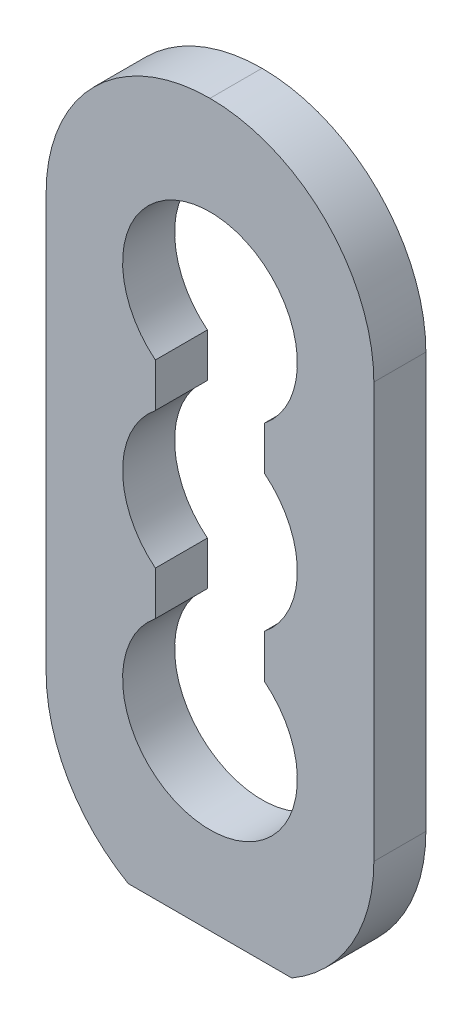
ISO-10303-21;
HEADER;
FILE_DESCRIPTION(('STEP AP214'),'2;1');
FILE_NAME('part.step','',(''),(''),'','','');
FILE_SCHEMA(('AUTOMOTIVE_DESIGN { 1 0 10303 214 1 1 1 1 }'));
ENDSEC;
DATA;
#1=APPLICATION_CONTEXT('core data for automotive mechanical design processes');
#2=APPLICATION_PROTOCOL_DEFINITION('international standard','automotive_design',2000,#1);
#3=PRODUCT_CONTEXT('',#1,'mechanical');
#4=PRODUCT('Part','Part','',(#3));
#5=PRODUCT_RELATED_PRODUCT_CATEGORY('part','',(#4));
#6=PRODUCT_DEFINITION_FORMATION('','',#4);
#7=PRODUCT_DEFINITION_CONTEXT('part definition',#1,'design');
#8=PRODUCT_DEFINITION('design','',#6,#7);
#9=PRODUCT_DEFINITION_SHAPE('','',#8);
#10=(LENGTH_UNIT() NAMED_UNIT(*) SI_UNIT(.MILLI.,.METRE.));
#11=(NAMED_UNIT(*) PLANE_ANGLE_UNIT() SI_UNIT($,.RADIAN.));
#12=(NAMED_UNIT(*) SI_UNIT($,.STERADIAN.) SOLID_ANGLE_UNIT());
#13=UNCERTAINTY_MEASURE_WITH_UNIT(LENGTH_MEASURE(1.E-05),#10,'distance_accuracy_value','');
#14=(GEOMETRIC_REPRESENTATION_CONTEXT(3) GLOBAL_UNCERTAINTY_ASSIGNED_CONTEXT((#13)) GLOBAL_UNIT_ASSIGNED_CONTEXT((#10,
#11,#12)) REPRESENTATION_CONTEXT('',''));
#15=CARTESIAN_POINT('',(0.,0.,0.));
#16=DIRECTION('',(0.,0.,1.));
#17=DIRECTION('',(1.,0.,0.));
#18=AXIS2_PLACEMENT_3D('',#15,#16,#17);
#19=CARTESIAN_POINT('',(-5.,14.,4.7625));
#20=DIRECTION('',(1.,0.,0.));
#21=DIRECTION('',(0.,1.,0.));
#22=AXIS2_PLACEMENT_3D('',#19,#20,#21);
#23=PLANE('',#22);
#24=DIRECTION('',(0.,0.,1.));
#25=VECTOR('',#24,1.);
#26=CARTESIAN_POINT('',(-4.99999999999999,10.7550020016016,-5.2375));
#27=LINE('',#26,#25);
#28=CARTESIAN_POINT('',(-5.,10.7550020016016,4.7625));
#29=VERTEX_POINT('',#28);
#30=CARTESIAN_POINT('',(-5.,10.7550020016016,0.));
#31=VERTEX_POINT('',#30);
#32=EDGE_CURVE('E192',#29,#31,#27,.F.);
#33=ORIENTED_EDGE('',*,*,#32,.F.);
#34=DIRECTION('',(0.,-1.,0.));
#35=VECTOR('',#34,1.);
#36=CARTESIAN_POINT('',(-5.,14.,4.7625));
#37=LINE('',#36,#35);
#38=CARTESIAN_POINT('',(-5.,6.74499799839826,4.7625));
#39=VERTEX_POINT('',#38);
#40=EDGE_CURVE('E218',#29,#39,#37,.T.);
#41=ORIENTED_EDGE('',*,*,#40,.T.);
#42=DIRECTION('',(0.,0.,1.));
#43=VECTOR('',#42,1.);
#44=CARTESIAN_POINT('',(-4.99999999999999,6.74499799839827,-5.2375));
#45=LINE('',#44,#43);
#46=CARTESIAN_POINT('',(-5.,6.74499799839826,0.));
#47=VERTEX_POINT('',#46);
#48=EDGE_CURVE('E325',#47,#39,#45,.T.);
#49=ORIENTED_EDGE('',*,*,#48,.F.);
#50=DIRECTION('',(0.,-1.,0.));
#51=VECTOR('',#50,1.);
#52=CARTESIAN_POINT('',(-5.,14.,0.));
#53=LINE('',#52,#51);
#54=EDGE_CURVE('E238',#31,#47,#53,.T.);
#55=ORIENTED_EDGE('',*,*,#54,.F.);
#56=EDGE_LOOP('',(#33,#41,#49,#55));
#57=FACE_BOUND('',#56,.T.);
#58=ADVANCED_FACE('F45',(#57),#23,.T.);
#59=CARTESIAN_POINT('',(5.00000000000001,14.,4.7625));
#60=DIRECTION('',(-1.,0.,0.));
#61=DIRECTION('',(0.,-1.,0.));
#62=AXIS2_PLACEMENT_3D('',#59,#60,#61);
#63=PLANE('',#62);
#64=DIRECTION('',(0.,0.,1.));
#65=VECTOR('',#64,1.);
#66=CARTESIAN_POINT('',(5.,-5.74499799839854,-5.2375));
#67=LINE('',#66,#65);
#68=CARTESIAN_POINT('',(5.00000000000001,-5.74499799839854,0.));
#69=VERTEX_POINT('',#68);
#70=CARTESIAN_POINT('',(5.00000000000001,-5.74499799839854,4.7625));
#71=VERTEX_POINT('',#70);
#72=EDGE_CURVE('E198',#69,#71,#67,.T.);
#73=ORIENTED_EDGE('',*,*,#72,.F.);
#74=DIRECTION('',(0.,1.,0.));
#75=VECTOR('',#74,1.);
#76=CARTESIAN_POINT('',(5.00000000000001,14.,0.));
#77=LINE('',#76,#75);
#78=CARTESIAN_POINT('',(5.,-9.75500200160131,0.));
#79=VERTEX_POINT('',#78);
#80=EDGE_CURVE('E242',#79,#69,#77,.T.);
#81=ORIENTED_EDGE('',*,*,#80,.F.);
#82=DIRECTION('',(0.,0.,1.));
#83=VECTOR('',#82,1.);
#84=CARTESIAN_POINT('',(5.,-9.75500200160131,-5.2375));
#85=LINE('',#84,#83);
#86=CARTESIAN_POINT('',(5.00000000000001,-9.75500200160131,4.7625));
#87=VERTEX_POINT('',#86);
#88=EDGE_CURVE('E186',#87,#79,#85,.F.);
#89=ORIENTED_EDGE('',*,*,#88,.F.);
#90=DIRECTION('',(0.,1.,0.));
#91=VECTOR('',#90,1.);
#92=CARTESIAN_POINT('',(5.00000000000001,14.,4.7625));
#93=LINE('',#92,#91);
#94=EDGE_CURVE('E225',#87,#71,#93,.T.);
#95=ORIENTED_EDGE('',*,*,#94,.T.);
#96=EDGE_LOOP('',(#73,#81,#89,#95));
#97=FACE_BOUND('',#96,.T.);
#98=ADVANCED_FACE('F353',(#97),#63,.T.);
#99=CARTESIAN_POINT('',(0.,0.,4.7625));
#100=DIRECTION('',(0.,0.,1.));
#101=DIRECTION('',(1.,0.,0.));
#102=AXIS2_PLACEMENT_3D('',#99,#100,#101);
#103=PLANE('',#102);
#104=DIRECTION('',(-1.,0.,0.));
#105=VECTOR('',#104,1.);
#106=CARTESIAN_POINT('',(-15.64400435528,-32.,4.7625));
#107=LINE('',#106,#105);
#108=CARTESIAN_POINT('',(7.48331477354788,-32.,4.7625));
#109=VERTEX_POINT('',#108);
#110=CARTESIAN_POINT('',(-7.48331477354788,-32.,4.7625));
#111=VERTEX_POINT('',#110);
#112=EDGE_CURVE('E151',#109,#111,#107,.T.);
#113=ORIENTED_EDGE('',*,*,#112,.F.);
#114=CARTESIAN_POINT('',(0.,-19.,4.7625));
#115=DIRECTION('',(0.,0.,1.));
#116=DIRECTION('',(1.,0.,0.));
#117=AXIS2_PLACEMENT_3D('',#114,#115,#116);
#118=CIRCLE('',#117,15.);
#119=CARTESIAN_POINT('',(15.,-19.,4.7625));
#120=VERTEX_POINT('',#119);
#121=EDGE_CURVE('E161',#109,#120,#118,.T.);
#122=ORIENTED_EDGE('',*,*,#121,.T.);
#123=DIRECTION('',(0.,1.,0.));
#124=VECTOR('',#123,1.);
#125=CARTESIAN_POINT('',(15.,34.,4.7625));
#126=LINE('',#125,#124);
#127=CARTESIAN_POINT('',(15.,19.,4.7625));
#128=VERTEX_POINT('',#127);
#129=EDGE_CURVE('E246',#120,#128,#126,.T.);
#130=ORIENTED_EDGE('',*,*,#129,.T.);
#131=CARTESIAN_POINT('',(0.,19.,4.7625));
#132=DIRECTION('',(0.,0.,1.));
#133=DIRECTION('',(1.,0.,0.));
#134=AXIS2_PLACEMENT_3D('',#131,#132,#133);
#135=CIRCLE('',#134,15.);
#136=CARTESIAN_POINT('',(0.,34.,4.7625));
#137=VERTEX_POINT('',#136);
#138=EDGE_CURVE('E273',#128,#137,#135,.T.);
#139=ORIENTED_EDGE('',*,*,#138,.T.);
#140=CARTESIAN_POINT('',(0.,19.,4.7625));
#141=DIRECTION('',(0.,0.,1.));
#142=DIRECTION('',(1.,0.,0.));
#143=AXIS2_PLACEMENT_3D('',#140,#141,#142);
#144=CIRCLE('',#143,15.);
#145=CARTESIAN_POINT('',(-15.,19.,4.7625));
#146=VERTEX_POINT('',#145);
#147=EDGE_CURVE('E180',#137,#146,#144,.T.);
#148=ORIENTED_EDGE('',*,*,#147,.T.);
#149=DIRECTION('',(0.,-1.,0.));
#150=VECTOR('',#149,1.);
#151=CARTESIAN_POINT('',(-15.,34.,4.7625));
#152=LINE('',#151,#150);
#153=CARTESIAN_POINT('',(-15.,-19.,4.7625));
#154=VERTEX_POINT('',#153);
#155=EDGE_CURVE('E243',#146,#154,#152,.T.);
#156=ORIENTED_EDGE('',*,*,#155,.T.);
#157=CARTESIAN_POINT('',(0.,-19.,4.7625));
#158=DIRECTION('',(0.,0.,1.));
#159=DIRECTION('',(1.,0.,0.));
#160=AXIS2_PLACEMENT_3D('',#157,#158,#159);
#161=CIRCLE('',#160,15.);
#162=EDGE_CURVE('E165',#154,#111,#161,.T.);
#163=ORIENTED_EDGE('',*,*,#162,.T.);
#164=EDGE_LOOP('',(#113,#122,#130,#139,#148,#156,#163));
#165=FACE_BOUND('',#164,.T.);
#166=CARTESIAN_POINT('',(0.,17.,4.7625));
#167=DIRECTION('',(0.,0.,1.));
#168=DIRECTION('',(1.,0.,0.));
#169=AXIS2_PLACEMENT_3D('',#166,#167,#168);
#170=CIRCLE('',#169,8.00000000000001);
#171=CARTESIAN_POINT('',(5.00000000000001,10.7550020016016,4.7625));
#172=VERTEX_POINT('',#171);
#173=EDGE_CURVE('E205',#172,#29,#170,.T.);
#174=ORIENTED_EDGE('',*,*,#173,.F.);
#175=CARTESIAN_POINT('',(5.00000000000001,6.74499799839856,4.7625));
#176=VERTEX_POINT('',#175);
#177=EDGE_CURVE('E216',#176,#172,#93,.T.);
#178=ORIENTED_EDGE('',*,*,#177,.F.);
#179=CARTESIAN_POINT('',(1.8626174806825E-13,0.500000000000007,4.7625));
#180=DIRECTION('',(0.,0.,1.));
#181=DIRECTION('',(1.,0.,0.));
#182=AXIS2_PLACEMENT_3D('',#179,#180,#181);
#183=CIRCLE('',#182,8.);
#184=EDGE_CURVE('E306',#71,#176,#183,.T.);
#185=ORIENTED_EDGE('',*,*,#184,.F.);
#186=ORIENTED_EDGE('',*,*,#94,.F.);
#187=CARTESIAN_POINT('',(3.58079740731689E-13,-16.,4.7625));
#188=DIRECTION('',(0.,0.,1.));
#189=DIRECTION('',(1.,0.,0.));
#190=AXIS2_PLACEMENT_3D('',#187,#188,#189);
#191=CIRCLE('',#190,8.);
#192=CARTESIAN_POINT('',(-4.99999999999999,-9.75500200160187,4.7625));
#193=VERTEX_POINT('',#192);
#194=EDGE_CURVE('E303',#193,#87,#191,.T.);
#195=ORIENTED_EDGE('',*,*,#194,.F.);
#196=CARTESIAN_POINT('',(-4.99999999999999,-5.74499799839825,4.7625));
#197=VERTEX_POINT('',#196);
#198=EDGE_CURVE('E231',#197,#193,#37,.T.);
#199=ORIENTED_EDGE('',*,*,#198,.F.);
#200=EDGE_CURVE('E68',#39,#197,#183,.T.);
#201=ORIENTED_EDGE('',*,*,#200,.F.);
#202=ORIENTED_EDGE('',*,*,#40,.F.);
#203=EDGE_LOOP('',(#174,#178,#185,#186,#195,#199,#201,#202));
#204=FACE_BOUND('',#203,.T.);
#205=ADVANCED_FACE('F158',(#165,#204),#103,.T.);
#206=CARTESIAN_POINT('',(0.,0.,0.));
#207=DIRECTION('',(0.,0.,1.));
#208=DIRECTION('',(1.,0.,0.));
#209=AXIS2_PLACEMENT_3D('',#206,#207,#208);
#210=PLANE('',#209);
#211=CARTESIAN_POINT('',(0.,-19.,0.));
#212=DIRECTION('',(0.,0.,1.));
#213=DIRECTION('',(1.,0.,0.));
#214=AXIS2_PLACEMENT_3D('',#211,#212,#213);
#215=CIRCLE('',#214,15.);
#216=CARTESIAN_POINT('',(15.,-19.,0.));
#217=VERTEX_POINT('',#216);
#218=CARTESIAN_POINT('',(7.48331477354788,-32.,0.));
#219=VERTEX_POINT('',#218);
#220=EDGE_CURVE('E270',#217,#219,#215,.F.);
#221=ORIENTED_EDGE('',*,*,#220,.T.);
#222=DIRECTION('',(-1.,0.,0.));
#223=VECTOR('',#222,1.);
#224=CARTESIAN_POINT('',(0.,-32.,0.));
#225=LINE('',#224,#223);
#226=CARTESIAN_POINT('',(-7.48331477354788,-32.,0.));
#227=VERTEX_POINT('',#226);
#228=EDGE_CURVE('E60',#219,#227,#225,.T.);
#229=ORIENTED_EDGE('',*,*,#228,.T.);
#230=CARTESIAN_POINT('',(0.,-19.,0.));
#231=DIRECTION('',(0.,0.,1.));
#232=DIRECTION('',(1.,0.,0.));
#233=AXIS2_PLACEMENT_3D('',#230,#231,#232);
#234=CIRCLE('',#233,15.);
#235=CARTESIAN_POINT('',(-15.,-19.,0.));
#236=VERTEX_POINT('',#235);
#237=EDGE_CURVE('E267',#227,#236,#234,.F.);
#238=ORIENTED_EDGE('',*,*,#237,.T.);
#239=DIRECTION('',(0.,-1.,0.));
#240=VECTOR('',#239,1.);
#241=CARTESIAN_POINT('',(-15.,34.,0.));
#242=LINE('',#241,#240);
#243=CARTESIAN_POINT('',(-15.,19.,0.));
#244=VERTEX_POINT('',#243);
#245=EDGE_CURVE('E230',#244,#236,#242,.T.);
#246=ORIENTED_EDGE('',*,*,#245,.F.);
#247=CARTESIAN_POINT('',(0.,19.,0.));
#248=DIRECTION('',(0.,0.,1.));
#249=DIRECTION('',(1.,0.,0.));
#250=AXIS2_PLACEMENT_3D('',#247,#248,#249);
#251=CIRCLE('',#250,15.);
#252=CARTESIAN_POINT('',(0.,34.,0.));
#253=VERTEX_POINT('',#252);
#254=EDGE_CURVE('E264',#244,#253,#251,.F.);
#255=ORIENTED_EDGE('',*,*,#254,.T.);
#256=CARTESIAN_POINT('',(0.,19.,0.));
#257=DIRECTION('',(0.,0.,1.));
#258=DIRECTION('',(1.,0.,0.));
#259=AXIS2_PLACEMENT_3D('',#256,#257,#258);
#260=CIRCLE('',#259,15.);
#261=CARTESIAN_POINT('',(15.,19.,0.));
#262=VERTEX_POINT('',#261);
#263=EDGE_CURVE('E261',#253,#262,#260,.F.);
#264=ORIENTED_EDGE('',*,*,#263,.T.);
#265=DIRECTION('',(0.,1.,0.));
#266=VECTOR('',#265,1.);
#267=CARTESIAN_POINT('',(15.,34.,0.));
#268=LINE('',#267,#266);
#269=EDGE_CURVE('E247',#217,#262,#268,.T.);
#270=ORIENTED_EDGE('',*,*,#269,.F.);
#271=EDGE_LOOP('',(#221,#229,#238,#246,#255,#264,#270));
#272=FACE_BOUND('',#271,.T.);
#273=CARTESIAN_POINT('',(5.,6.74499799839856,0.));
#274=VERTEX_POINT('',#273);
#275=CARTESIAN_POINT('',(5.00000000000001,10.7550020016016,0.));
#276=VERTEX_POINT('',#275);
#277=EDGE_CURVE('E239',#274,#276,#77,.T.);
#278=ORIENTED_EDGE('',*,*,#277,.T.);
#279=CARTESIAN_POINT('',(0.,17.,0.));
#280=DIRECTION('',(0.,0.,1.));
#281=DIRECTION('',(1.,0.,0.));
#282=AXIS2_PLACEMENT_3D('',#279,#280,#281);
#283=CIRCLE('',#282,8.00000000000001);
#284=EDGE_CURVE('E208',#276,#31,#283,.T.);
#285=ORIENTED_EDGE('',*,*,#284,.T.);
#286=ORIENTED_EDGE('',*,*,#54,.T.);
#287=CARTESIAN_POINT('',(1.8626174806825E-13,0.500000000000007,0.));
#288=DIRECTION('',(0.,0.,1.));
#289=DIRECTION('',(1.,0.,0.));
#290=AXIS2_PLACEMENT_3D('',#287,#288,#289);
#291=CIRCLE('',#290,8.);
#292=CARTESIAN_POINT('',(-4.99999999999999,-5.74499799839825,0.));
#293=VERTEX_POINT('',#292);
#294=EDGE_CURVE('E322',#47,#293,#291,.T.);
#295=ORIENTED_EDGE('',*,*,#294,.T.);
#296=CARTESIAN_POINT('',(-4.99999999999999,-9.75500200160187,0.));
#297=VERTEX_POINT('',#296);
#298=EDGE_CURVE('E191',#293,#297,#53,.T.);
#299=ORIENTED_EDGE('',*,*,#298,.T.);
#300=CARTESIAN_POINT('',(3.58079740731689E-13,-16.,0.));
#301=DIRECTION('',(0.,0.,1.));
#302=DIRECTION('',(1.,0.,0.));
#303=AXIS2_PLACEMENT_3D('',#300,#301,#302);
#304=CIRCLE('',#303,8.);
#305=EDGE_CURVE('E220',#297,#79,#304,.T.);
#306=ORIENTED_EDGE('',*,*,#305,.T.);
#307=ORIENTED_EDGE('',*,*,#80,.T.);
#308=EDGE_CURVE('E317',#69,#274,#291,.T.);
#309=ORIENTED_EDGE('',*,*,#308,.T.);
#310=EDGE_LOOP('',(#278,#285,#286,#295,#299,#306,#307,#309));
#311=FACE_BOUND('',#310,.T.);
#312=ADVANCED_FACE('F289',(#272,#311),#210,.F.);
#313=CARTESIAN_POINT('',(-15.,34.,4.7625));
#314=DIRECTION('',(1.,0.,0.));
#315=DIRECTION('',(0.,1.,0.));
#316=AXIS2_PLACEMENT_3D('',#313,#314,#315);
#317=PLANE('',#316);
#318=ORIENTED_EDGE('',*,*,#245,.T.);
#319=DIRECTION('',(0.,0.,-1.));
#320=VECTOR('',#319,1.);
#321=CARTESIAN_POINT('',(-15.,-19.,4.7625));
#322=LINE('',#321,#320);
#323=EDGE_CURVE('E178',#236,#154,#322,.F.);
#324=ORIENTED_EDGE('',*,*,#323,.T.);
#325=ORIENTED_EDGE('',*,*,#155,.F.);
#326=DIRECTION('',(0.,0.,-1.));
#327=VECTOR('',#326,1.);
#328=CARTESIAN_POINT('',(-15.,19.,4.7625));
#329=LINE('',#328,#327);
#330=EDGE_CURVE('E173',#146,#244,#329,.T.);
#331=ORIENTED_EDGE('',*,*,#330,.T.);
#332=EDGE_LOOP('',(#318,#324,#325,#331));
#333=FACE_BOUND('',#332,.T.);
#334=ADVANCED_FACE('F283',(#333),#317,.F.);
#335=CARTESIAN_POINT('',(15.,34.,4.7625));
#336=DIRECTION('',(-1.,0.,0.));
#337=DIRECTION('',(0.,-1.,0.));
#338=AXIS2_PLACEMENT_3D('',#335,#336,#337);
#339=PLANE('',#338);
#340=ORIENTED_EDGE('',*,*,#129,.F.);
#341=DIRECTION('',(0.,0.,-1.));
#342=VECTOR('',#341,1.);
#343=CARTESIAN_POINT('',(15.,-19.,4.7625));
#344=LINE('',#343,#342);
#345=EDGE_CURVE('E171',#120,#217,#344,.T.);
#346=ORIENTED_EDGE('',*,*,#345,.T.);
#347=ORIENTED_EDGE('',*,*,#269,.T.);
#348=DIRECTION('',(0.,0.,-1.));
#349=VECTOR('',#348,1.);
#350=CARTESIAN_POINT('',(15.,19.,4.7625));
#351=LINE('',#350,#349);
#352=EDGE_CURVE('E250',#262,#128,#351,.F.);
#353=ORIENTED_EDGE('',*,*,#352,.T.);
#354=EDGE_LOOP('',(#340,#346,#347,#353));
#355=FACE_BOUND('',#354,.T.);
#356=ADVANCED_FACE('F295',(#355),#339,.F.);
#357=DIRECTION('',(0.,0.,1.));
#358=VECTOR('',#357,1.);
#359=CARTESIAN_POINT('',(-4.99999999999999,-5.74499799839825,-5.2375));
#360=LINE('',#359,#358);
#361=EDGE_CURVE('E321',#197,#293,#360,.F.);
#362=ORIENTED_EDGE('',*,*,#361,.F.);
#363=ORIENTED_EDGE('',*,*,#198,.T.);
#364=DIRECTION('',(0.,0.,1.));
#365=VECTOR('',#364,1.);
#366=CARTESIAN_POINT('',(-4.99999999999999,-9.75500200160187,-5.2375));
#367=LINE('',#366,#365);
#368=EDGE_CURVE('E314',#297,#193,#367,.T.);
#369=ORIENTED_EDGE('',*,*,#368,.F.);
#370=ORIENTED_EDGE('',*,*,#298,.F.);
#371=EDGE_LOOP('',(#362,#363,#369,#370));
#372=FACE_BOUND('',#371,.T.);
#373=ADVANCED_FACE('F343',(#372),#23,.T.);
#374=DIRECTION('',(0.,0.,1.));
#375=VECTOR('',#374,1.);
#376=CARTESIAN_POINT('',(5.,10.7550020016016,-5.2375));
#377=LINE('',#376,#375);
#378=EDGE_CURVE('E54',#276,#172,#377,.T.);
#379=ORIENTED_EDGE('',*,*,#378,.F.);
#380=ORIENTED_EDGE('',*,*,#277,.F.);
#381=DIRECTION('',(0.,0.,1.));
#382=VECTOR('',#381,1.);
#383=CARTESIAN_POINT('',(5.,6.74499799839856,-5.2375));
#384=LINE('',#383,#382);
#385=EDGE_CURVE('E195',#176,#274,#384,.F.);
#386=ORIENTED_EDGE('',*,*,#385,.F.);
#387=ORIENTED_EDGE('',*,*,#177,.T.);
#388=EDGE_LOOP('',(#379,#380,#386,#387));
#389=FACE_BOUND('',#388,.T.);
#390=ADVANCED_FACE('F223',(#389),#63,.T.);
#391=CARTESIAN_POINT('',(0.,-19.,4.7625));
#392=DIRECTION('',(0.,0.,-1.));
#393=DIRECTION('',(-1.,0.,0.));
#394=AXIS2_PLACEMENT_3D('',#391,#392,#393);
#395=CYLINDRICAL_SURFACE('',#394,15.);
#396=DIRECTION('',(0.,0.,-1.));
#397=VECTOR('',#396,1.);
#398=CARTESIAN_POINT('',(-7.48331477354788,-32.,4.7625));
#399=LINE('',#398,#397);
#400=EDGE_CURVE('E298',#111,#227,#399,.T.);
#401=ORIENTED_EDGE('',*,*,#400,.F.);
#402=ORIENTED_EDGE('',*,*,#162,.F.);
#403=ORIENTED_EDGE('',*,*,#323,.F.);
#404=ORIENTED_EDGE('',*,*,#237,.F.);
#405=EDGE_LOOP('',(#401,#402,#403,#404));
#406=FACE_BOUND('',#405,.T.);
#407=ADVANCED_FACE('F301',(#406),#395,.T.);
#408=CARTESIAN_POINT('',(0.,-19.,4.7625));
#409=DIRECTION('',(0.,0.,-1.));
#410=DIRECTION('',(-1.,0.,0.));
#411=AXIS2_PLACEMENT_3D('',#408,#409,#410);
#412=CYLINDRICAL_SURFACE('',#411,15.);
#413=DIRECTION('',(0.,0.,-1.));
#414=VECTOR('',#413,1.);
#415=CARTESIAN_POINT('',(7.48331477354788,-32.,4.7625));
#416=LINE('',#415,#414);
#417=EDGE_CURVE('E11',#219,#109,#416,.F.);
#418=ORIENTED_EDGE('',*,*,#417,.F.);
#419=ORIENTED_EDGE('',*,*,#220,.F.);
#420=ORIENTED_EDGE('',*,*,#345,.F.);
#421=ORIENTED_EDGE('',*,*,#121,.F.);
#422=EDGE_LOOP('',(#418,#419,#420,#421));
#423=FACE_BOUND('',#422,.T.);
#424=ADVANCED_FACE('F169',(#423),#412,.T.);
#425=CARTESIAN_POINT('',(0.,19.,4.7625));
#426=DIRECTION('',(0.,0.,-1.));
#427=DIRECTION('',(-1.,0.,0.));
#428=AXIS2_PLACEMENT_3D('',#425,#426,#427);
#429=CYLINDRICAL_SURFACE('',#428,15.);
#430=DIRECTION('',(0.,0.,-1.));
#431=VECTOR('',#430,1.);
#432=CARTESIAN_POINT('',(0.,34.,4.7625));
#433=LINE('',#432,#431);
#434=EDGE_CURVE('E187',#137,#253,#433,.T.);
#435=ORIENTED_EDGE('',*,*,#434,.F.);
#436=ORIENTED_EDGE('',*,*,#138,.F.);
#437=ORIENTED_EDGE('',*,*,#352,.F.);
#438=ORIENTED_EDGE('',*,*,#263,.F.);
#439=EDGE_LOOP('',(#435,#436,#437,#438));
#440=FACE_BOUND('',#439,.T.);
#441=ADVANCED_FACE('F47',(#440),#429,.T.);
#442=CARTESIAN_POINT('',(0.,19.,4.7625));
#443=DIRECTION('',(0.,0.,-1.));
#444=DIRECTION('',(-1.,0.,0.));
#445=AXIS2_PLACEMENT_3D('',#442,#443,#444);
#446=CYLINDRICAL_SURFACE('',#445,15.);
#447=ORIENTED_EDGE('',*,*,#147,.F.);
#448=ORIENTED_EDGE('',*,*,#434,.T.);
#449=ORIENTED_EDGE('',*,*,#254,.F.);
#450=ORIENTED_EDGE('',*,*,#330,.F.);
#451=EDGE_LOOP('',(#447,#448,#449,#450));
#452=FACE_BOUND('',#451,.T.);
#453=ADVANCED_FACE('F286',(#452),#446,.T.);
#454=CARTESIAN_POINT('',(3.58079740731689E-13,-16.,-5.2375));
#455=DIRECTION('',(0.,0.,1.));
#456=DIRECTION('',(1.,0.,0.));
#457=AXIS2_PLACEMENT_3D('',#454,#455,#456);
#458=CYLINDRICAL_SURFACE('',#457,8.);
#459=ORIENTED_EDGE('',*,*,#368,.T.);
#460=ORIENTED_EDGE('',*,*,#194,.T.);
#461=ORIENTED_EDGE('',*,*,#88,.T.);
#462=ORIENTED_EDGE('',*,*,#305,.F.);
#463=EDGE_LOOP('',(#459,#460,#461,#462));
#464=FACE_BOUND('',#463,.T.);
#465=ADVANCED_FACE('F349',(#464),#458,.F.);
#466=CARTESIAN_POINT('',(1.8626174806825E-13,0.500000000000007,-5.2375));
#467=DIRECTION('',(0.,0.,1.));
#468=DIRECTION('',(1.,0.,0.));
#469=AXIS2_PLACEMENT_3D('',#466,#467,#468);
#470=CYLINDRICAL_SURFACE('',#469,8.);
#471=ORIENTED_EDGE('',*,*,#72,.T.);
#472=ORIENTED_EDGE('',*,*,#184,.T.);
#473=ORIENTED_EDGE('',*,*,#385,.T.);
#474=ORIENTED_EDGE('',*,*,#308,.F.);
#475=EDGE_LOOP('',(#471,#472,#473,#474));
#476=FACE_BOUND('',#475,.T.);
#477=ADVANCED_FACE('F359',(#476),#470,.F.);
#478=CARTESIAN_POINT('',(0.,17.,-5.2375));
#479=DIRECTION('',(0.,0.,1.));
#480=DIRECTION('',(1.,0.,0.));
#481=AXIS2_PLACEMENT_3D('',#478,#479,#480);
#482=CYLINDRICAL_SURFACE('',#481,8.00000000000001);
#483=ORIENTED_EDGE('',*,*,#32,.T.);
#484=ORIENTED_EDGE('',*,*,#284,.F.);
#485=ORIENTED_EDGE('',*,*,#378,.T.);
#486=ORIENTED_EDGE('',*,*,#173,.T.);
#487=EDGE_LOOP('',(#483,#484,#485,#486));
#488=FACE_BOUND('',#487,.T.);
#489=ADVANCED_FACE('F204',(#488),#482,.F.);
#490=ORIENTED_EDGE('',*,*,#48,.T.);
#491=ORIENTED_EDGE('',*,*,#200,.T.);
#492=ORIENTED_EDGE('',*,*,#361,.T.);
#493=ORIENTED_EDGE('',*,*,#294,.F.);
#494=EDGE_LOOP('',(#490,#491,#492,#493));
#495=FACE_BOUND('',#494,.T.);
#496=ADVANCED_FACE('F356',(#495),#470,.F.);
#497=CARTESIAN_POINT('',(-15.64400435528,-32.,-5.2375));
#498=DIRECTION('',(0.,1.,0.));
#499=DIRECTION('',(0.,0.,1.));
#500=AXIS2_PLACEMENT_3D('',#497,#498,#499);
#501=PLANE('',#500);
#502=ORIENTED_EDGE('',*,*,#400,.T.);
#503=ORIENTED_EDGE('',*,*,#228,.F.);
#504=ORIENTED_EDGE('',*,*,#417,.T.);
#505=ORIENTED_EDGE('',*,*,#112,.T.);
#506=EDGE_LOOP('',(#502,#503,#504,#505));
#507=FACE_BOUND('',#506,.T.);
#508=ADVANCED_FACE('F150',(#507),#501,.F.);
#509=CLOSED_SHELL('',(#58,#98,#205,#312,#334,#356,#373,#390,#407,#424,#441,#453,#465,#477,#489,
#496,#508));
#510=MANIFOLD_SOLID_BREP('B2',#509);
#511=ADVANCED_BREP_SHAPE_REPRESENTATION('',(#18,#510),#14);
#512=SHAPE_DEFINITION_REPRESENTATION(#9,#511);
ENDSEC;
END-ISO-10303-21;
